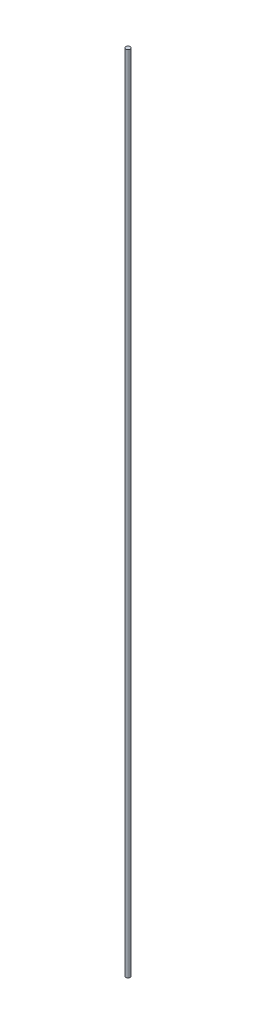
ISO-10303-21;
HEADER;
FILE_DESCRIPTION(('STEP AP214'),'2;1');
FILE_NAME('part.step','',(''),(''),'','','');
FILE_SCHEMA(('AUTOMOTIVE_DESIGN { 1 0 10303 214 1 1 1 1 }'));
ENDSEC;
DATA;
#1=APPLICATION_CONTEXT('core data for automotive mechanical design processes');
#2=APPLICATION_PROTOCOL_DEFINITION('international standard','automotive_design',2000,#1);
#3=PRODUCT_CONTEXT('',#1,'mechanical');
#4=PRODUCT('Part','Part','',(#3));
#5=PRODUCT_RELATED_PRODUCT_CATEGORY('part','',(#4));
#6=PRODUCT_DEFINITION_FORMATION('','',#4);
#7=PRODUCT_DEFINITION_CONTEXT('part definition',#1,'design');
#8=PRODUCT_DEFINITION('design','',#6,#7);
#9=PRODUCT_DEFINITION_SHAPE('','',#8);
#10=(LENGTH_UNIT() NAMED_UNIT(*) SI_UNIT(.MILLI.,.METRE.));
#11=(NAMED_UNIT(*) PLANE_ANGLE_UNIT() SI_UNIT($,.RADIAN.));
#12=(NAMED_UNIT(*) SI_UNIT($,.STERADIAN.) SOLID_ANGLE_UNIT());
#13=UNCERTAINTY_MEASURE_WITH_UNIT(LENGTH_MEASURE(1.E-05),#10,'distance_accuracy_value','');
#14=(GEOMETRIC_REPRESENTATION_CONTEXT(3) GLOBAL_UNCERTAINTY_ASSIGNED_CONTEXT((#13)) GLOBAL_UNIT_ASSIGNED_CONTEXT((#10,
#11,#12)) REPRESENTATION_CONTEXT('',''));
#15=CARTESIAN_POINT('',(0.,0.,0.));
#16=DIRECTION('',(0.,0.,1.));
#17=DIRECTION('',(1.,0.,0.));
#18=AXIS2_PLACEMENT_3D('',#15,#16,#17);
#19=CARTESIAN_POINT('',(0.,700.,0.));
#20=DIRECTION('',(0.,-1.,0.));
#21=DIRECTION('',(0.,0.,-1.));
#22=AXIS2_PLACEMENT_3D('',#19,#20,#21);
#23=CYLINDRICAL_SURFACE('',#22,2.);
#24=CARTESIAN_POINT('',(0.,700.,0.));
#25=DIRECTION('',(0.,1.,0.));
#26=DIRECTION('',(0.,0.,1.));
#27=AXIS2_PLACEMENT_3D('',#24,#25,#26);
#28=CIRCLE('',#27,2.);
#29=CARTESIAN_POINT('',(0.,700.,2.));
#30=VERTEX_POINT('',#29);
#31=EDGE_CURVE('E10',#30,#30,#28,.T.);
#32=ORIENTED_EDGE('',*,*,#31,.F.);
#33=EDGE_LOOP('',(#32));
#34=FACE_BOUND('',#33,.T.);
#35=CARTESIAN_POINT('',(0.,0.,0.));
#36=DIRECTION('',(0.,1.,0.));
#37=DIRECTION('',(0.,0.,1.));
#38=AXIS2_PLACEMENT_3D('',#35,#36,#37);
#39=CIRCLE('',#38,2.);
#40=CARTESIAN_POINT('',(0.,0.,2.));
#41=VERTEX_POINT('',#40);
#42=EDGE_CURVE('E46',#41,#41,#39,.T.);
#43=ORIENTED_EDGE('',*,*,#42,.T.);
#44=EDGE_LOOP('',(#43));
#45=FACE_BOUND('',#44,.T.);
#46=ADVANCED_FACE('F43',(#34,#45),#23,.T.);
#47=CARTESIAN_POINT('',(0.,700.,0.));
#48=DIRECTION('',(0.,1.,0.));
#49=DIRECTION('',(0.,0.,1.));
#50=AXIS2_PLACEMENT_3D('',#47,#48,#49);
#51=PLANE('',#50);
#52=ORIENTED_EDGE('',*,*,#31,.T.);
#53=EDGE_LOOP('',(#52));
#54=FACE_BOUND('',#53,.T.);
#55=ADVANCED_FACE('F60',(#54),#51,.T.);
#56=CARTESIAN_POINT('',(0.,0.,0.));
#57=DIRECTION('',(0.,1.,0.));
#58=DIRECTION('',(0.,0.,1.));
#59=AXIS2_PLACEMENT_3D('',#56,#57,#58);
#60=PLANE('',#59);
#61=ORIENTED_EDGE('',*,*,#42,.F.);
#62=EDGE_LOOP('',(#61));
#63=FACE_BOUND('',#62,.T.);
#64=ADVANCED_FACE('F58',(#63),#60,.F.);
#65=CLOSED_SHELL('',(#46,#55,#64));
#66=MANIFOLD_SOLID_BREP('B2',#65);
#67=ADVANCED_BREP_SHAPE_REPRESENTATION('',(#18,#66),#14);
#68=SHAPE_DEFINITION_REPRESENTATION(#9,#67);
ENDSEC;
END-ISO-10303-21;
